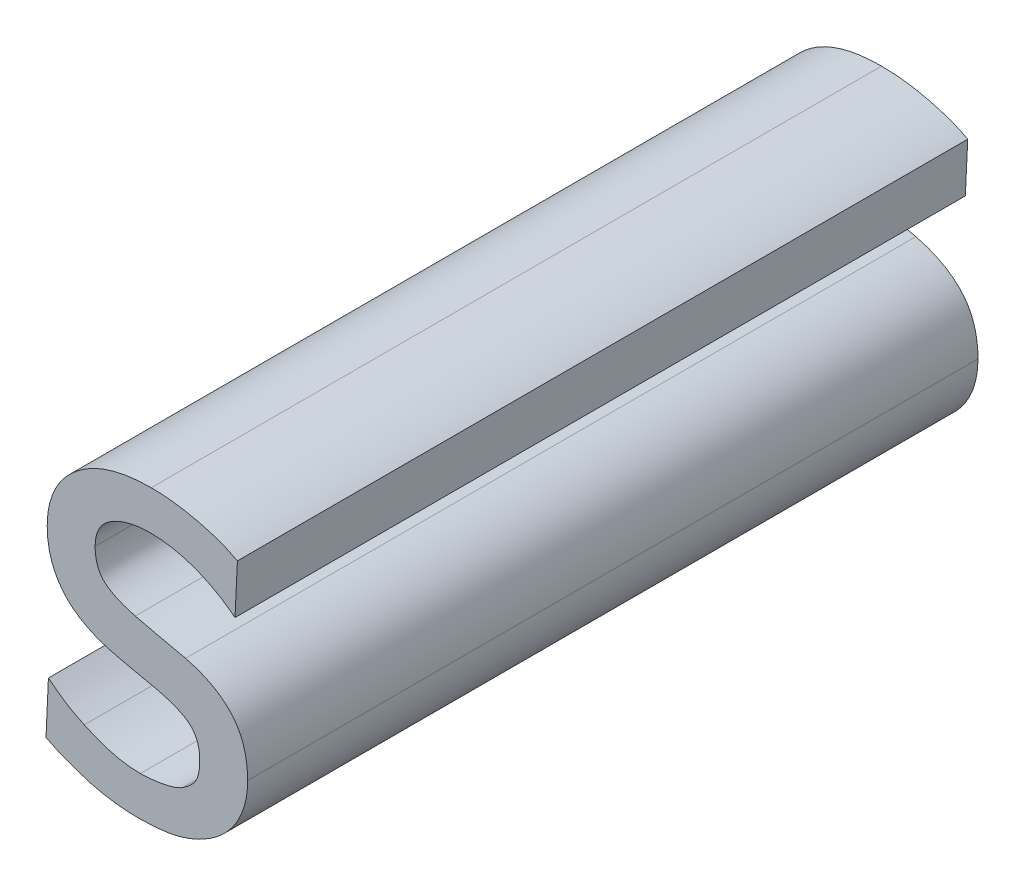
ISO-10303-21;
HEADER;
FILE_DESCRIPTION(('STEP AP214'),'2;1');
FILE_NAME('part.step','',(''),(''),'','','');
FILE_SCHEMA(('AUTOMOTIVE_DESIGN { 1 0 10303 214 1 1 1 1 }'));
ENDSEC;
DATA;
#1=APPLICATION_CONTEXT('core data for automotive mechanical design processes');
#2=APPLICATION_PROTOCOL_DEFINITION('international standard','automotive_design',2000,#1);
#3=PRODUCT_CONTEXT('',#1,'mechanical');
#4=PRODUCT('Part','Part','',(#3));
#5=PRODUCT_RELATED_PRODUCT_CATEGORY('part','',(#4));
#6=PRODUCT_DEFINITION_FORMATION('','',#4);
#7=PRODUCT_DEFINITION_CONTEXT('part definition',#1,'design');
#8=PRODUCT_DEFINITION('design','',#6,#7);
#9=PRODUCT_DEFINITION_SHAPE('','',#8);
#10=(LENGTH_UNIT() NAMED_UNIT(*) SI_UNIT(.MILLI.,.METRE.));
#11=(NAMED_UNIT(*) PLANE_ANGLE_UNIT() SI_UNIT($,.RADIAN.));
#12=(NAMED_UNIT(*) SI_UNIT($,.STERADIAN.) SOLID_ANGLE_UNIT());
#13=UNCERTAINTY_MEASURE_WITH_UNIT(LENGTH_MEASURE(1.E-05),#10,'distance_accuracy_value','');
#14=(GEOMETRIC_REPRESENTATION_CONTEXT(3) GLOBAL_UNCERTAINTY_ASSIGNED_CONTEXT((#13)) GLOBAL_UNIT_ASSIGNED_CONTEXT((#10,
#11,#12)) REPRESENTATION_CONTEXT('',''));
#15=CARTESIAN_POINT('',(0.,0.,0.));
#16=DIRECTION('',(0.,0.,1.));
#17=DIRECTION('',(1.,0.,0.));
#18=AXIS2_PLACEMENT_3D('',#15,#16,#17);
#19=CARTESIAN_POINT('',(-1.643826227401,-1.896351951922,0.));
#20=DIRECTION('',(-1.,0.,0.));
#21=DIRECTION('',(0.,-1.,0.));
#22=AXIS2_PLACEMENT_3D('',#19,#20,#21);
#23=PLANE('',#22);
#24=DIRECTION('',(0.,1.,0.));
#25=VECTOR('',#24,1.);
#26=CARTESIAN_POINT('',(-1.643826227401,-1.903575382263,0.));
#27=LINE('',#26,#25);
#28=CARTESIAN_POINT('',(-1.643826227401,-1.903575382263,0.));
#29=VERTEX_POINT('',#28);
#30=CARTESIAN_POINT('',(-1.643496013443,-1.896351951922,0.));
#31=VERTEX_POINT('',#30);
#32=EDGE_CURVE('E11',#29,#31,#27,.T.);
#33=ORIENTED_EDGE('',*,*,#32,.F.);
#34=DIRECTION('',(0.,0.,1.));
#35=VECTOR('',#34,1.);
#36=CARTESIAN_POINT('',(-1.643826227401,-1.903575382263,0.));
#37=LINE('',#36,#35);
#38=CARTESIAN_POINT('',(-1.643826227401,-1.903575382263,0.1));
#39=VERTEX_POINT('',#38);
#40=EDGE_CURVE('E25',#29,#39,#37,.T.);
#41=ORIENTED_EDGE('',*,*,#40,.T.);
#42=DIRECTION('',(0.,-1.,0.));
#43=VECTOR('',#42,1.);
#44=CARTESIAN_POINT('',(-1.643826227401,-1.903575382263,0.1));
#45=LINE('',#44,#43);
#46=CARTESIAN_POINT('',(-1.643496013443,-1.896351951922,0.1));
#47=VERTEX_POINT('',#46);
#48=EDGE_CURVE('E168',#47,#39,#45,.T.);
#49=ORIENTED_EDGE('',*,*,#48,.F.);
#50=CARTESIAN_POINT('',(-1.643496013443,-1.896351951922,0.));
#51=CARTESIAN_POINT('',(-1.643496013443,-1.896351951922,0.00416666666666667));
#52=CARTESIAN_POINT('',(-1.643496013443,-1.896351951922,0.00833333333333334));
#53=CARTESIAN_POINT('',(-1.643496013443,-1.896351951922,0.0166666666666667));
#54=CARTESIAN_POINT('',(-1.643496013443,-1.896351951922,0.0208333333333333));
#55=CARTESIAN_POINT('',(-1.643496013443,-1.896351951922,0.0291666666666667));
#56=CARTESIAN_POINT('',(-1.643496013443,-1.896351951922,0.0333333333333333));
#57=CARTESIAN_POINT('',(-1.643496013443,-1.896351951922,0.0416666666666667));
#58=CARTESIAN_POINT('',(-1.643496013443,-1.896351951922,0.0458333333333333));
#59=CARTESIAN_POINT('',(-1.643496013443,-1.896351951922,0.0541666666666667));
#60=CARTESIAN_POINT('',(-1.643496013443,-1.896351951922,0.0583333333333333));
#61=CARTESIAN_POINT('',(-1.643496013443,-1.896351951922,0.0666666666666667));
#62=CARTESIAN_POINT('',(-1.643496013443,-1.896351951922,0.0708333333333333));
#63=CARTESIAN_POINT('',(-1.643496013443,-1.896351951922,0.0791666666666667));
#64=CARTESIAN_POINT('',(-1.643496013443,-1.896351951922,0.0833333333333333));
#65=CARTESIAN_POINT('',(-1.643496013443,-1.896351951922,0.0916666666666667));
#66=CARTESIAN_POINT('',(-1.643496013443,-1.896351951922,0.0958333333333333));
#67=CARTESIAN_POINT('',(-1.643496013443,-1.896351951922,0.1));
#68=B_SPLINE_CURVE_WITH_KNOTS('',3,(#50,#51,#52,#53,#54,#55,#56,#57,#58,#59,#60,#61,#62,#63,#64,
#65,#66,#67),.UNSPECIFIED.,.F.,.F.,(4,2,2,2,2,2,2,2,4),(0.,0.0125,0.025,0.0375,0.05,0.0625,
0.075,0.0875,0.1),.UNSPECIFIED.);
#69=EDGE_CURVE('E437',#31,#47,#68,.T.);
#70=ORIENTED_EDGE('',*,*,#69,.F.);
#71=EDGE_LOOP('',(#33,#41,#49,#70));
#72=FACE_BOUND('',#71,.T.);
#73=ADVANCED_FACE('F17',(#72),#23,.T.);
#74=CARTESIAN_POINT('',(-1.63858408081,-1.899447707782,0.));
#75=CARTESIAN_POINT('',(-1.63858408081,-1.899447707782,0.1));
#76=CARTESIAN_POINT('',(-1.640441534327,-1.898580896141,0.));
#77=CARTESIAN_POINT('',(-1.640441534327,-1.898580896141,0.1));
#78=CARTESIAN_POINT('',(-1.642670478547,-1.897012379839,0.));
#79=CARTESIAN_POINT('',(-1.642670478547,-1.897012379839,0.1));
#80=CARTESIAN_POINT('',(-1.643496013443,-1.896351951922,0.));
#81=CARTESIAN_POINT('',(-1.643496013443,-1.896351951922,0.1));
#82=B_SPLINE_SURFACE_WITH_KNOTS('',2,1,((#74,#75),(#76,#77),(#78,#79),(#80,#81)),.UNSPECIFIED.,
.F.,.F.,.F.,(3,1,3),(2,2),(-2.,-1.,0.),(0.,0.01),.UNSPECIFIED.);
#83=CARTESIAN_POINT('',(-1.643496013443,-1.896351951922,0.));
#84=CARTESIAN_POINT('',(-1.642670478547,-1.897012379839,0.));
#85=CARTESIAN_POINT('',(-1.640441534327,-1.898580896141,0.));
#86=CARTESIAN_POINT('',(-1.63858408081,-1.899447707782,0.));
#87=B_SPLINE_CURVE_WITH_KNOTS('',2,(#83,#84,#85,#86),.UNSPECIFIED.,.F.,.F.,(3,1,3),(0.,1.,2.),.UNSPECIFIED.);
#88=CARTESIAN_POINT('',(-1.63858408081,-1.899447707782,0.));
#89=VERTEX_POINT('',#88);
#90=EDGE_CURVE('E635',#31,#89,#87,.T.);
#91=CARTESIAN_POINT('',(-1.63858408081,-1.899447707782,0.1));
#92=CARTESIAN_POINT('',(-1.640441534327,-1.898580896141,0.1));
#93=CARTESIAN_POINT('',(-1.642670478547,-1.897012379839,0.1));
#94=CARTESIAN_POINT('',(-1.643496013443,-1.896351951922,0.1));
#95=B_SPLINE_CURVE_WITH_KNOTS('',2,(#91,#92,#93,#94),.UNSPECIFIED.,.F.,.F.,(3,1,3),(-2.,-1.,0.),.UNSPECIFIED.);
#96=CARTESIAN_POINT('',(-1.63858408081,-1.899447707782,0.1));
#97=VERTEX_POINT('',#96);
#98=EDGE_CURVE('E626',#97,#47,#95,.T.);
#99=DIRECTION('',(0.,0.,1.));
#100=VECTOR('',#99,1.);
#101=CARTESIAN_POINT('',(-1.63858408081,-1.899447707782,0.));
#102=LINE('',#101,#100);
#103=EDGE_CURVE('E620',#89,#97,#102,.T.);
#104=ORIENTED_EDGE('',*,*,#90,.F.);
#105=ORIENTED_EDGE('',*,*,#69,.T.);
#106=ORIENTED_EDGE('',*,*,#98,.F.);
#107=ORIENTED_EDGE('',*,*,#103,.F.);
#108=EDGE_LOOP('',(#104,#105,#106,#107));
#109=FACE_BOUND('',#108,.T.);
#110=ADVANCED_FACE('F406',(#109),#82,.T.);
#111=CARTESIAN_POINT('',(-1.630906606276,-1.901387714789,0.));
#112=CARTESIAN_POINT('',(-1.630906606276,-1.901387714789,0.1));
#113=CARTESIAN_POINT('',(-1.633011720261,-1.901387714789,0.));
#114=CARTESIAN_POINT('',(-1.633011720261,-1.901387714789,0.1));
#115=CARTESIAN_POINT('',(-1.636974287763,-1.900231965934,0.));
#116=CARTESIAN_POINT('',(-1.636974287763,-1.900231965934,0.1));
#117=CARTESIAN_POINT('',(-1.63858408081,-1.899447707782,0.));
#118=CARTESIAN_POINT('',(-1.63858408081,-1.899447707782,0.1));
#119=B_SPLINE_SURFACE_WITH_KNOTS('',2,1,((#111,#112),(#113,#114),(#115,#116),(#117,#118)),
.UNSPECIFIED.,.F.,.F.,.F.,(3,1,3),(2,2),(-2.,-1.,0.),(0.,0.01),.UNSPECIFIED.);
#120=CARTESIAN_POINT('',(-1.63858408081,-1.899447707782,0.));
#121=CARTESIAN_POINT('',(-1.636974287763,-1.900231965934,0.));
#122=CARTESIAN_POINT('',(-1.633011720261,-1.901387714789,0.));
#123=CARTESIAN_POINT('',(-1.630906606276,-1.901387714789,0.));
#124=B_SPLINE_CURVE_WITH_KNOTS('',2,(#120,#121,#122,#123),.UNSPECIFIED.,.F.,.F.,(3,1,3),(0.,1.,
2.),.UNSPECIFIED.);
#125=CARTESIAN_POINT('',(-1.630906606276,-1.901387714789,0.));
#126=VERTEX_POINT('',#125);
#127=EDGE_CURVE('E613',#89,#126,#124,.T.);
#128=CARTESIAN_POINT('',(-1.630906606276,-1.901387714789,0.1));
#129=CARTESIAN_POINT('',(-1.633011720261,-1.901387714789,0.1));
#130=CARTESIAN_POINT('',(-1.636974287763,-1.900231965934,0.1));
#131=CARTESIAN_POINT('',(-1.63858408081,-1.899447707782,0.1));
#132=B_SPLINE_CURVE_WITH_KNOTS('',2,(#128,#129,#130,#131),.UNSPECIFIED.,.F.,.F.,(3,1,3),(-2.,
-1.,0.),.UNSPECIFIED.);
#133=CARTESIAN_POINT('',(-1.630906606276,-1.901387714789,0.1));
#134=VERTEX_POINT('',#133);
#135=EDGE_CURVE('E608',#134,#97,#132,.T.);
#136=DIRECTION('',(0.,0.,1.));
#137=VECTOR('',#136,1.);
#138=CARTESIAN_POINT('',(-1.630906606276,-1.901387714789,0.));
#139=LINE('',#138,#137);
#140=EDGE_CURVE('E602',#126,#134,#139,.T.);
#141=ORIENTED_EDGE('',*,*,#127,.F.);
#142=ORIENTED_EDGE('',*,*,#103,.T.);
#143=ORIENTED_EDGE('',*,*,#135,.F.);
#144=ORIENTED_EDGE('',*,*,#140,.F.);
#145=EDGE_LOOP('',(#141,#142,#143,#144));
#146=FACE_BOUND('',#145,.T.);
#147=ADVANCED_FACE('F396',(#146),#119,.T.);
#148=CARTESIAN_POINT('',(-1.625045308513,-1.900108135699,0.));
#149=CARTESIAN_POINT('',(-1.625045308513,-1.900108135699,0.1));
#150=CARTESIAN_POINT('',(-1.625870843409,-1.900686010127,0.));
#151=CARTESIAN_POINT('',(-1.625870843409,-1.900686010127,0.1));
#152=CARTESIAN_POINT('',(-1.629379366718,-1.901387714789,0.));
#153=CARTESIAN_POINT('',(-1.629379366718,-1.901387714789,0.1));
#154=CARTESIAN_POINT('',(-1.630906606276,-1.901387714789,0.));
#155=CARTESIAN_POINT('',(-1.630906606276,-1.901387714789,0.1));
#156=B_SPLINE_SURFACE_WITH_KNOTS('',2,1,((#148,#149),(#150,#151),(#152,#153),(#154,#155)),
.UNSPECIFIED.,.F.,.F.,.F.,(3,1,3),(2,2),(-2.,-1.,0.),(0.,0.01),.UNSPECIFIED.);
#157=CARTESIAN_POINT('',(-1.630906606276,-1.901387714789,0.));
#158=CARTESIAN_POINT('',(-1.629379366718,-1.901387714789,0.));
#159=CARTESIAN_POINT('',(-1.625870843409,-1.900686010127,0.));
#160=CARTESIAN_POINT('',(-1.625045308513,-1.900108135699,0.));
#161=B_SPLINE_CURVE_WITH_KNOTS('',2,(#157,#158,#159,#160),.UNSPECIFIED.,.F.,.F.,(3,1,3),(0.,1.,
2.),.UNSPECIFIED.);
#162=CARTESIAN_POINT('',(-1.625045308513,-1.900108135699,0.));
#163=VERTEX_POINT('',#162);
#164=EDGE_CURVE('E595',#126,#163,#161,.T.);
#165=CARTESIAN_POINT('',(-1.625045308513,-1.900108135699,0.1));
#166=CARTESIAN_POINT('',(-1.625870843409,-1.900686010127,0.1));
#167=CARTESIAN_POINT('',(-1.629379366718,-1.901387714789,0.1));
#168=CARTESIAN_POINT('',(-1.630906606276,-1.901387714789,0.1));
#169=B_SPLINE_CURVE_WITH_KNOTS('',2,(#165,#166,#167,#168),.UNSPECIFIED.,.F.,.F.,(3,1,3),(-2.,
-1.,0.),.UNSPECIFIED.);
#170=CARTESIAN_POINT('',(-1.625045308513,-1.900108135699,0.1));
#171=VERTEX_POINT('',#170);
#172=EDGE_CURVE('E590',#171,#134,#169,.T.);
#173=DIRECTION('',(0.,0.,1.));
#174=VECTOR('',#173,1.);
#175=CARTESIAN_POINT('',(-1.625045308513,-1.900108135699,0.));
#176=LINE('',#175,#174);
#177=EDGE_CURVE('E584',#163,#171,#176,.T.);
#178=ORIENTED_EDGE('',*,*,#164,.F.);
#179=ORIENTED_EDGE('',*,*,#140,.T.);
#180=ORIENTED_EDGE('',*,*,#172,.F.);
#181=ORIENTED_EDGE('',*,*,#177,.F.);
#182=EDGE_LOOP('',(#178,#179,#180,#181));
#183=FACE_BOUND('',#182,.T.);
#184=ADVANCED_FACE('F385',(#183),#156,.T.);
#185=CARTESIAN_POINT('',(-1.622775087548,-1.89573280075,0.));
#186=CARTESIAN_POINT('',(-1.622775087548,-1.89573280075,0.1));
#187=CARTESIAN_POINT('',(-1.622775087548,-1.897548977521,0.));
#188=CARTESIAN_POINT('',(-1.622775087548,-1.897548977521,0.1));
#189=CARTESIAN_POINT('',(-1.623848282913,-1.899323877548,0.));
#190=CARTESIAN_POINT('',(-1.623848282913,-1.899323877548,0.1));
#191=CARTESIAN_POINT('',(-1.625045308513,-1.900108135699,0.));
#192=CARTESIAN_POINT('',(-1.625045308513,-1.900108135699,0.1));
#193=B_SPLINE_SURFACE_WITH_KNOTS('',2,1,((#185,#186),(#187,#188),(#189,#190),(#191,#192)),
.UNSPECIFIED.,.F.,.F.,.F.,(3,1,3),(2,2),(-2.,-1.,0.),(0.,0.01),.UNSPECIFIED.);
#194=CARTESIAN_POINT('',(-1.625045308513,-1.900108135699,0.));
#195=CARTESIAN_POINT('',(-1.623848282913,-1.899323877548,0.));
#196=CARTESIAN_POINT('',(-1.622775087548,-1.897548977521,0.));
#197=CARTESIAN_POINT('',(-1.622775087548,-1.89573280075,0.));
#198=B_SPLINE_CURVE_WITH_KNOTS('',2,(#194,#195,#196,#197),.UNSPECIFIED.,.F.,.F.,(3,1,3),(0.,1.,
2.),.UNSPECIFIED.);
#199=CARTESIAN_POINT('',(-1.622775087548,-1.89573280075,0.));
#200=VERTEX_POINT('',#199);
#201=EDGE_CURVE('E577',#163,#200,#198,.T.);
#202=CARTESIAN_POINT('',(-1.622775087548,-1.89573280075,0.1));
#203=CARTESIAN_POINT('',(-1.622775087548,-1.897548977521,0.1));
#204=CARTESIAN_POINT('',(-1.623848282913,-1.899323877548,0.1));
#205=CARTESIAN_POINT('',(-1.625045308513,-1.900108135699,0.1));
#206=B_SPLINE_CURVE_WITH_KNOTS('',2,(#202,#203,#204,#205),.UNSPECIFIED.,.F.,.F.,(3,1,3),(-2.,
-1.,0.),.UNSPECIFIED.);
#207=CARTESIAN_POINT('',(-1.622775087548,-1.89573280075,0.1));
#208=VERTEX_POINT('',#207);
#209=EDGE_CURVE('E572',#208,#171,#206,.T.);
#210=DIRECTION('',(0.,0.,1.));
#211=VECTOR('',#210,1.);
#212=CARTESIAN_POINT('',(-1.622775087548,-1.89573280075,0.));
#213=LINE('',#212,#211);
#214=EDGE_CURVE('E566',#200,#208,#213,.T.);
#215=ORIENTED_EDGE('',*,*,#201,.F.);
#216=ORIENTED_EDGE('',*,*,#177,.T.);
#217=ORIENTED_EDGE('',*,*,#209,.F.);
#218=ORIENTED_EDGE('',*,*,#214,.F.);
#219=EDGE_LOOP('',(#215,#216,#217,#218));
#220=FACE_BOUND('',#219,.T.);
#221=ADVANCED_FACE('F374',(#220),#193,.T.);
#222=CARTESIAN_POINT('',(-1.628430001587,-1.89032554718,0.));
#223=CARTESIAN_POINT('',(-1.628430001587,-1.89032554718,0.1));
#224=CARTESIAN_POINT('',(-1.625251692237,-1.891109805331,0.));
#225=CARTESIAN_POINT('',(-1.625251692237,-1.891109805331,0.1));
#226=CARTESIAN_POINT('',(-1.622775087548,-1.893462579785,0.));
#227=CARTESIAN_POINT('',(-1.622775087548,-1.893462579785,0.1));
#228=CARTESIAN_POINT('',(-1.622775087548,-1.89573280075,0.));
#229=CARTESIAN_POINT('',(-1.622775087548,-1.89573280075,0.1));
#230=B_SPLINE_SURFACE_WITH_KNOTS('',2,1,((#222,#223),(#224,#225),(#226,#227),(#228,#229)),
.UNSPECIFIED.,.F.,.F.,.F.,(3,1,3),(2,2),(-2.,-1.,0.),(0.,0.01),.UNSPECIFIED.);
#231=CARTESIAN_POINT('',(-1.622775087548,-1.89573280075,0.));
#232=CARTESIAN_POINT('',(-1.622775087548,-1.893462579785,0.));
#233=CARTESIAN_POINT('',(-1.625251692237,-1.891109805331,0.));
#234=CARTESIAN_POINT('',(-1.628430001587,-1.89032554718,0.));
#235=B_SPLINE_CURVE_WITH_KNOTS('',2,(#231,#232,#233,#234),.UNSPECIFIED.,.F.,.F.,(3,1,3),(0.,1.,
2.),.UNSPECIFIED.);
#236=CARTESIAN_POINT('',(-1.628430001587,-1.89032554718,0.));
#237=VERTEX_POINT('',#236);
#238=EDGE_CURVE('E559',#200,#237,#235,.T.);
#239=CARTESIAN_POINT('',(-1.628430001587,-1.89032554718,0.1));
#240=CARTESIAN_POINT('',(-1.625251692237,-1.891109805331,0.1));
#241=CARTESIAN_POINT('',(-1.622775087548,-1.893462579785,0.1));
#242=CARTESIAN_POINT('',(-1.622775087548,-1.89573280075,0.1));
#243=B_SPLINE_CURVE_WITH_KNOTS('',2,(#239,#240,#241,#242),.UNSPECIFIED.,.F.,.F.,(3,1,3),(-2.,
-1.,0.),.UNSPECIFIED.);
#244=CARTESIAN_POINT('',(-1.628430001587,-1.89032554718,0.1));
#245=VERTEX_POINT('',#244);
#246=EDGE_CURVE('E554',#245,#208,#243,.T.);
#247=DIRECTION('',(0.,0.,1.));
#248=VECTOR('',#247,1.);
#249=CARTESIAN_POINT('',(-1.628430001587,-1.89032554718,0.));
#250=LINE('',#249,#248);
#251=EDGE_CURVE('E548',#237,#245,#250,.T.);
#252=ORIENTED_EDGE('',*,*,#238,.F.);
#253=ORIENTED_EDGE('',*,*,#214,.T.);
#254=ORIENTED_EDGE('',*,*,#246,.F.);
#255=ORIENTED_EDGE('',*,*,#251,.F.);
#256=EDGE_LOOP('',(#252,#253,#254,#255));
#257=FACE_BOUND('',#256,.T.);
#258=ADVANCED_FACE('F363',(#257),#230,.T.);
#259=CARTESIAN_POINT('',(-1.635323217971,-1.888757030877,0.));
#260=CARTESIAN_POINT('',(-1.635323217971,-1.888757030877,0.1));
#261=CARTESIAN_POINT('',(-1.633630871433,-1.88921107507,0.));
#262=CARTESIAN_POINT('',(-1.633630871433,-1.88921107507,0.1));
#263=CARTESIAN_POINT('',(-1.629668303932,-1.890036609966,0.));
#264=CARTESIAN_POINT('',(-1.629668303932,-1.890036609966,0.1));
#265=CARTESIAN_POINT('',(-1.628430001587,-1.89032554718,0.));
#266=CARTESIAN_POINT('',(-1.628430001587,-1.89032554718,0.1));
#267=B_SPLINE_SURFACE_WITH_KNOTS('',2,1,((#259,#260),(#261,#262),(#263,#264),(#265,#266)),
.UNSPECIFIED.,.F.,.F.,.F.,(3,1,3),(2,2),(-2.,-1.,0.),(0.,0.01),.UNSPECIFIED.);
#268=CARTESIAN_POINT('',(-1.628430001587,-1.89032554718,0.));
#269=CARTESIAN_POINT('',(-1.629668303932,-1.890036609966,0.));
#270=CARTESIAN_POINT('',(-1.633630871433,-1.88921107507,0.));
#271=CARTESIAN_POINT('',(-1.635323217971,-1.888757030877,0.));
#272=B_SPLINE_CURVE_WITH_KNOTS('',2,(#268,#269,#270,#271),.UNSPECIFIED.,.F.,.F.,(3,1,3),(0.,1.,
2.),.UNSPECIFIED.);
#273=CARTESIAN_POINT('',(-1.635323217971,-1.888757030877,0.));
#274=VERTEX_POINT('',#273);
#275=EDGE_CURVE('E541',#237,#274,#272,.T.);
#276=CARTESIAN_POINT('',(-1.635323217971,-1.888757030877,0.1));
#277=CARTESIAN_POINT('',(-1.633630871433,-1.88921107507,0.1));
#278=CARTESIAN_POINT('',(-1.629668303932,-1.890036609966,0.1));
#279=CARTESIAN_POINT('',(-1.628430001587,-1.89032554718,0.1));
#280=B_SPLINE_CURVE_WITH_KNOTS('',2,(#276,#277,#278,#279),.UNSPECIFIED.,.F.,.F.,(3,1,3),(-2.,
-1.,0.),.UNSPECIFIED.);
#281=CARTESIAN_POINT('',(-1.635323217971,-1.888757030877,0.1));
#282=VERTEX_POINT('',#281);
#283=EDGE_CURVE('E536',#282,#245,#280,.T.);
#284=DIRECTION('',(0.,0.,1.));
#285=VECTOR('',#284,1.);
#286=CARTESIAN_POINT('',(-1.635323217971,-1.888757030877,0.));
#287=LINE('',#286,#285);
#288=EDGE_CURVE('E530',#274,#282,#287,.T.);
#289=ORIENTED_EDGE('',*,*,#275,.F.);
#290=ORIENTED_EDGE('',*,*,#251,.T.);
#291=ORIENTED_EDGE('',*,*,#283,.F.);
#292=ORIENTED_EDGE('',*,*,#288,.F.);
#293=EDGE_LOOP('',(#289,#290,#291,#292));
#294=FACE_BOUND('',#293,.T.);
#295=ADVANCED_FACE('F352',(#294),#267,.T.);
#296=CARTESIAN_POINT('',(-1.643661120422,-1.878437844674,0.));
#297=CARTESIAN_POINT('',(-1.643661120422,-1.878437844674,0.1));
#298=CARTESIAN_POINT('',(-1.643661120422,-1.882194028452,0.));
#299=CARTESIAN_POINT('',(-1.643661120422,-1.882194028452,0.1));
#300=CARTESIAN_POINT('',(-1.63969855292,-1.887477451788,0.));
#301=CARTESIAN_POINT('',(-1.63969855292,-1.887477451788,0.1));
#302=CARTESIAN_POINT('',(-1.635323217971,-1.888757030877,0.));
#303=CARTESIAN_POINT('',(-1.635323217971,-1.888757030877,0.1));
#304=B_SPLINE_SURFACE_WITH_KNOTS('',2,1,((#296,#297),(#298,#299),(#300,#301),(#302,#303)),
.UNSPECIFIED.,.F.,.F.,.F.,(3,1,3),(2,2),(-2.,-1.,0.),(0.,0.01),.UNSPECIFIED.);
#305=CARTESIAN_POINT('',(-1.635323217971,-1.888757030877,0.));
#306=CARTESIAN_POINT('',(-1.63969855292,-1.887477451788,0.));
#307=CARTESIAN_POINT('',(-1.643661120422,-1.882194028452,0.));
#308=CARTESIAN_POINT('',(-1.643661120422,-1.878437844674,0.));
#309=B_SPLINE_CURVE_WITH_KNOTS('',2,(#305,#306,#307,#308),.UNSPECIFIED.,.F.,.F.,(3,1,3),(0.,1.,
2.),.UNSPECIFIED.);
#310=CARTESIAN_POINT('',(-1.643661120422,-1.878437844674,0.));
#311=VERTEX_POINT('',#310);
#312=EDGE_CURVE('E523',#274,#311,#309,.T.);
#313=CARTESIAN_POINT('',(-1.643661120422,-1.878437844674,0.1));
#314=CARTESIAN_POINT('',(-1.643661120422,-1.882194028452,0.1));
#315=CARTESIAN_POINT('',(-1.63969855292,-1.887477451788,0.1));
#316=CARTESIAN_POINT('',(-1.635323217971,-1.888757030877,0.1));
#317=B_SPLINE_CURVE_WITH_KNOTS('',2,(#313,#314,#315,#316),.UNSPECIFIED.,.F.,.F.,(3,1,3),(-2.,
-1.,0.),.UNSPECIFIED.);
#318=CARTESIAN_POINT('',(-1.643661120422,-1.878437844674,0.1));
#319=VERTEX_POINT('',#318);
#320=EDGE_CURVE('E518',#319,#282,#317,.T.);
#321=DIRECTION('',(0.,0.,1.));
#322=VECTOR('',#321,1.);
#323=CARTESIAN_POINT('',(-1.643661120422,-1.878437844674,0.));
#324=LINE('',#323,#322);
#325=EDGE_CURVE('E512',#311,#319,#324,.T.);
#326=ORIENTED_EDGE('',*,*,#312,.F.);
#327=ORIENTED_EDGE('',*,*,#288,.T.);
#328=ORIENTED_EDGE('',*,*,#320,.F.);
#329=ORIENTED_EDGE('',*,*,#325,.F.);
#330=EDGE_LOOP('',(#326,#327,#328,#329));
#331=FACE_BOUND('',#330,.T.);
#332=ADVANCED_FACE('F341',(#331),#304,.T.);
#333=CARTESIAN_POINT('',(-1.629420643463,-1.866756525893,0.));
#334=CARTESIAN_POINT('',(-1.629420643463,-1.866756525893,0.1));
#335=CARTESIAN_POINT('',(-1.635859815653,-1.866756525893,0.));
#336=CARTESIAN_POINT('',(-1.635859815653,-1.866756525893,0.1));
#337=CARTESIAN_POINT('',(-1.643661120422,-1.873236974828,0.));
#338=CARTESIAN_POINT('',(-1.643661120422,-1.873236974828,0.1));
#339=CARTESIAN_POINT('',(-1.643661120422,-1.878437844674,0.));
#340=CARTESIAN_POINT('',(-1.643661120422,-1.878437844674,0.1));
#341=B_SPLINE_SURFACE_WITH_KNOTS('',2,1,((#333,#334),(#335,#336),(#337,#338),(#339,#340)),
.UNSPECIFIED.,.F.,.F.,.F.,(3,1,3),(2,2),(-2.,-1.,0.),(0.,0.01),.UNSPECIFIED.);
#342=CARTESIAN_POINT('',(-1.643661120422,-1.878437844674,0.));
#343=CARTESIAN_POINT('',(-1.643661120422,-1.873236974828,0.));
#344=CARTESIAN_POINT('',(-1.635859815653,-1.866756525893,0.));
#345=CARTESIAN_POINT('',(-1.629420643463,-1.866756525893,0.));
#346=B_SPLINE_CURVE_WITH_KNOTS('',2,(#342,#343,#344,#345),.UNSPECIFIED.,.F.,.F.,(3,1,3),(0.,1.,
2.),.UNSPECIFIED.);
#347=CARTESIAN_POINT('',(-1.629420643463,-1.866756525893,0.));
#348=VERTEX_POINT('',#347);
#349=EDGE_CURVE('E505',#311,#348,#346,.T.);
#350=CARTESIAN_POINT('',(-1.629420643463,-1.866756525893,0.1));
#351=CARTESIAN_POINT('',(-1.635859815653,-1.866756525893,0.1));
#352=CARTESIAN_POINT('',(-1.643661120422,-1.873236974828,0.1));
#353=CARTESIAN_POINT('',(-1.643661120422,-1.878437844674,0.1));
#354=B_SPLINE_CURVE_WITH_KNOTS('',2,(#350,#351,#352,#353),.UNSPECIFIED.,.F.,.F.,(3,1,3),(-2.,
-1.,0.),.UNSPECIFIED.);
#355=CARTESIAN_POINT('',(-1.629420643463,-1.866756525893,0.1));
#356=VERTEX_POINT('',#355);
#357=EDGE_CURVE('E500',#356,#319,#354,.T.);
#358=DIRECTION('',(0.,0.,1.));
#359=VECTOR('',#358,1.);
#360=CARTESIAN_POINT('',(-1.629420643463,-1.866756525893,0.));
#361=LINE('',#360,#359);
#362=EDGE_CURVE('E494',#348,#356,#361,.T.);
#363=ORIENTED_EDGE('',*,*,#349,.F.);
#364=ORIENTED_EDGE('',*,*,#325,.T.);
#365=ORIENTED_EDGE('',*,*,#357,.F.);
#366=ORIENTED_EDGE('',*,*,#362,.F.);
#367=EDGE_LOOP('',(#363,#364,#365,#366));
#368=FACE_BOUND('',#367,.T.);
#369=ADVANCED_FACE('F330',(#368),#341,.T.);
#370=CARTESIAN_POINT('',(-1.617615494447,-1.869522067795,0.));
#371=CARTESIAN_POINT('',(-1.617615494447,-1.869522067795,0.1));
#372=CARTESIAN_POINT('',(-1.619803161922,-1.868325042196,0.));
#373=CARTESIAN_POINT('',(-1.619803161922,-1.868325042196,0.1));
#374=CARTESIAN_POINT('',(-1.626242334112,-1.866756525893,0.));
#375=CARTESIAN_POINT('',(-1.626242334112,-1.866756525893,0.1));
#376=CARTESIAN_POINT('',(-1.629420643463,-1.866756525893,0.));
#377=CARTESIAN_POINT('',(-1.629420643463,-1.866756525893,0.1));
#378=B_SPLINE_SURFACE_WITH_KNOTS('',2,1,((#370,#371),(#372,#373),(#374,#375),(#376,#377)),
.UNSPECIFIED.,.F.,.F.,.F.,(3,1,3),(2,2),(-2.,-1.,0.),(0.,0.01),.UNSPECIFIED.);
#379=CARTESIAN_POINT('',(-1.629420643463,-1.866756525893,0.));
#380=CARTESIAN_POINT('',(-1.626242334112,-1.866756525893,0.));
#381=CARTESIAN_POINT('',(-1.619803161922,-1.868325042196,0.));
#382=CARTESIAN_POINT('',(-1.617615494447,-1.869522067795,0.));
#383=B_SPLINE_CURVE_WITH_KNOTS('',2,(#379,#380,#381,#382),.UNSPECIFIED.,.F.,.F.,(3,1,3),(0.,1.,
2.),.UNSPECIFIED.);
#384=CARTESIAN_POINT('',(-1.617615494447,-1.869522067795,0.));
#385=VERTEX_POINT('',#384);
#386=EDGE_CURVE('E487',#348,#385,#383,.T.);
#387=CARTESIAN_POINT('',(-1.617615494447,-1.869522067795,0.1));
#388=CARTESIAN_POINT('',(-1.619803161922,-1.868325042196,0.1));
#389=CARTESIAN_POINT('',(-1.626242334112,-1.866756525893,0.1));
#390=CARTESIAN_POINT('',(-1.629420643463,-1.866756525893,0.1));
#391=B_SPLINE_CURVE_WITH_KNOTS('',2,(#387,#388,#389,#390),.UNSPECIFIED.,.F.,.F.,(3,1,3),(-2.,
-1.,0.),.UNSPECIFIED.);
#392=CARTESIAN_POINT('',(-1.617615494447,-1.869522067795,0.1));
#393=VERTEX_POINT('',#392);
#394=EDGE_CURVE('E482',#393,#356,#391,.T.);
#395=DIRECTION('',(0.,0.,1.));
#396=VECTOR('',#395,1.);
#397=CARTESIAN_POINT('',(-1.617615494447,-1.869522067795,0.));
#398=LINE('',#397,#396);
#399=EDGE_CURVE('E479',#385,#393,#398,.T.);
#400=ORIENTED_EDGE('',*,*,#386,.F.);
#401=ORIENTED_EDGE('',*,*,#362,.T.);
#402=ORIENTED_EDGE('',*,*,#394,.F.);
#403=ORIENTED_EDGE('',*,*,#399,.F.);
#404=EDGE_LOOP('',(#400,#401,#402,#403));
#405=FACE_BOUND('',#404,.T.);
#406=ADVANCED_FACE('F320',(#405),#378,.T.);
#407=CARTESIAN_POINT('',(-1.617615494447,-1.876415284179,0.));
#408=DIRECTION('',(1.,0.,0.));
#409=DIRECTION('',(0.,1.,0.));
#410=AXIS2_PLACEMENT_3D('',#407,#408,#409);
#411=PLANE('',#410);
#412=DIRECTION('',(0.,-1.,0.));
#413=VECTOR('',#412,1.);
#414=CARTESIAN_POINT('',(-1.617615494447,-1.869522067795,0.));
#415=LINE('',#414,#413);
#416=CARTESIAN_POINT('',(-1.617945708406,-1.876415284179,0.));
#417=VERTEX_POINT('',#416);
#418=EDGE_CURVE('E475',#385,#417,#415,.T.);
#419=ORIENTED_EDGE('',*,*,#418,.F.);
#420=ORIENTED_EDGE('',*,*,#399,.T.);
#421=DIRECTION('',(0.,1.,0.));
#422=VECTOR('',#421,1.);
#423=CARTESIAN_POINT('',(-1.617615494447,-1.869522067795,0.1));
#424=LINE('',#423,#422);
#425=CARTESIAN_POINT('',(-1.617945708406,-1.876415284179,0.1));
#426=VERTEX_POINT('',#425);
#427=EDGE_CURVE('E468',#426,#393,#424,.T.);
#428=ORIENTED_EDGE('',*,*,#427,.F.);
#429=CARTESIAN_POINT('',(-1.617945708406,-1.876415284179,0.));
#430=CARTESIAN_POINT('',(-1.617945708406,-1.876415284179,0.00416666666666668));
#431=CARTESIAN_POINT('',(-1.617945708406,-1.876415284179,0.00833333333333334));
#432=CARTESIAN_POINT('',(-1.617945708406,-1.876415284179,0.0166666666666667));
#433=CARTESIAN_POINT('',(-1.617945708406,-1.876415284179,0.0208333333333333));
#434=CARTESIAN_POINT('',(-1.617945708406,-1.876415284179,0.0291666666666667));
#435=CARTESIAN_POINT('',(-1.617945708406,-1.876415284179,0.0333333333333333));
#436=CARTESIAN_POINT('',(-1.617945708406,-1.876415284179,0.0416666666666667));
#437=CARTESIAN_POINT('',(-1.617945708406,-1.876415284179,0.0458333333333333));
#438=CARTESIAN_POINT('',(-1.617945708406,-1.876415284179,0.0541666666666667));
#439=CARTESIAN_POINT('',(-1.617945708406,-1.876415284179,0.0583333333333333));
#440=CARTESIAN_POINT('',(-1.617945708406,-1.876415284179,0.0666666666666667));
#441=CARTESIAN_POINT('',(-1.617945708406,-1.876415284179,0.0708333333333333));
#442=CARTESIAN_POINT('',(-1.617945708406,-1.876415284179,0.0791666666666667));
#443=CARTESIAN_POINT('',(-1.617945708406,-1.876415284179,0.0833333333333333));
#444=CARTESIAN_POINT('',(-1.617945708406,-1.876415284179,0.0916666666666667));
#445=CARTESIAN_POINT('',(-1.617945708406,-1.876415284179,0.0958333333333333));
#446=CARTESIAN_POINT('',(-1.617945708406,-1.876415284179,0.1));
#447=B_SPLINE_CURVE_WITH_KNOTS('',3,(#429,#430,#431,#432,#433,#434,#435,#436,#437,#438,#439,
#440,#441,#442,#443,#444,#445,#446),.UNSPECIFIED.,.F.,.F.,(4,2,2,2,2,2,2,2,4),(0.,0.0125,0.025,
0.0375,0.05,0.0625,0.075,0.0875,0.1),.UNSPECIFIED.);
#448=EDGE_CURVE('E302',#417,#426,#447,.T.);
#449=ORIENTED_EDGE('',*,*,#448,.F.);
#450=EDGE_LOOP('',(#419,#420,#428,#449));
#451=FACE_BOUND('',#450,.T.);
#452=ADVANCED_FACE('F309',(#451),#411,.T.);
#453=CARTESIAN_POINT('',(-1.629544473697,-1.872163779463,0.));
#454=CARTESIAN_POINT('',(-1.629544473697,-1.872163779463,0.1));
#455=CARTESIAN_POINT('',(-1.626448717836,-1.872163779463,0.));
#456=CARTESIAN_POINT('',(-1.626448717836,-1.872163779463,0.1));
#457=CARTESIAN_POINT('',(-1.620422313094,-1.874434000428,0.));
#458=CARTESIAN_POINT('',(-1.620422313094,-1.874434000428,0.1));
#459=CARTESIAN_POINT('',(-1.617945708406,-1.876415284179,0.));
#460=CARTESIAN_POINT('',(-1.617945708406,-1.876415284179,0.1));
#461=B_SPLINE_SURFACE_WITH_KNOTS('',2,1,((#453,#454),(#455,#456),(#457,#458),(#459,#460)),
.UNSPECIFIED.,.F.,.F.,.F.,(3,1,3),(2,2),(-2.,-1.,0.),(0.,0.01),.UNSPECIFIED.);
#462=CARTESIAN_POINT('',(-1.617945708406,-1.876415284179,0.));
#463=CARTESIAN_POINT('',(-1.620422313094,-1.874434000428,0.));
#464=CARTESIAN_POINT('',(-1.626448717836,-1.872163779463,0.));
#465=CARTESIAN_POINT('',(-1.629544473697,-1.872163779463,0.));
#466=B_SPLINE_CURVE_WITH_KNOTS('',2,(#462,#463,#464,#465),.UNSPECIFIED.,.F.,.F.,(3,1,3),(0.,1.,
2.),.UNSPECIFIED.);
#467=CARTESIAN_POINT('',(-1.629544473697,-1.872163779463,0.));
#468=VERTEX_POINT('',#467);
#469=EDGE_CURVE('E293',#417,#468,#466,.T.);
#470=CARTESIAN_POINT('',(-1.629544473697,-1.872163779463,0.1));
#471=CARTESIAN_POINT('',(-1.626448717836,-1.872163779463,0.1));
#472=CARTESIAN_POINT('',(-1.620422313094,-1.874434000428,0.1));
#473=CARTESIAN_POINT('',(-1.617945708406,-1.876415284179,0.1));
#474=B_SPLINE_CURVE_WITH_KNOTS('',2,(#470,#471,#472,#473),.UNSPECIFIED.,.F.,.F.,(3,1,3),(-2.,
-1.,0.),.UNSPECIFIED.);
#475=CARTESIAN_POINT('',(-1.629544473697,-1.872163779463,0.1));
#476=VERTEX_POINT('',#475);
#477=EDGE_CURVE('E283',#476,#426,#474,.T.);
#478=DIRECTION('',(0.,0.,1.));
#479=VECTOR('',#478,1.);
#480=CARTESIAN_POINT('',(-1.629544473697,-1.872163779463,0.));
#481=LINE('',#480,#479);
#482=EDGE_CURVE('E277',#468,#476,#481,.T.);
#483=ORIENTED_EDGE('',*,*,#469,.F.);
#484=ORIENTED_EDGE('',*,*,#448,.T.);
#485=ORIENTED_EDGE('',*,*,#477,.F.);
#486=ORIENTED_EDGE('',*,*,#482,.F.);
#487=EDGE_LOOP('',(#483,#484,#485,#486));
#488=FACE_BOUND('',#487,.T.);
#489=ADVANCED_FACE('F319',(#488),#461,.T.);
#490=CARTESIAN_POINT('',(-1.637098117997,-1.877529756288,0.));
#491=CARTESIAN_POINT('',(-1.637098117997,-1.877529756288,0.1));
#492=CARTESIAN_POINT('',(-1.637098117997,-1.874846767876,0.));
#493=CARTESIAN_POINT('',(-1.637098117997,-1.874846767876,0.1));
#494=CARTESIAN_POINT('',(-1.632722783047,-1.872163779463,0.));
#495=CARTESIAN_POINT('',(-1.632722783047,-1.872163779463,0.1));
#496=CARTESIAN_POINT('',(-1.629544473697,-1.872163779463,0.));
#497=CARTESIAN_POINT('',(-1.629544473697,-1.872163779463,0.1));
#498=B_SPLINE_SURFACE_WITH_KNOTS('',2,1,((#490,#491),(#492,#493),(#494,#495),(#496,#497)),
.UNSPECIFIED.,.F.,.F.,.F.,(3,1,3),(2,2),(-2.,-1.,0.),(0.,0.01),.UNSPECIFIED.);
#499=CARTESIAN_POINT('',(-1.629544473697,-1.872163779463,0.));
#500=CARTESIAN_POINT('',(-1.632722783047,-1.872163779463,0.));
#501=CARTESIAN_POINT('',(-1.637098117997,-1.874846767876,0.));
#502=CARTESIAN_POINT('',(-1.637098117997,-1.877529756288,0.));
#503=B_SPLINE_CURVE_WITH_KNOTS('',2,(#499,#500,#501,#502),.UNSPECIFIED.,.F.,.F.,(3,1,3),(0.,1.,
2.),.UNSPECIFIED.);
#504=CARTESIAN_POINT('',(-1.637098117997,-1.877529756288,0.));
#505=VERTEX_POINT('',#504);
#506=EDGE_CURVE('E270',#468,#505,#503,.T.);
#507=CARTESIAN_POINT('',(-1.637098117997,-1.877529756288,0.1));
#508=CARTESIAN_POINT('',(-1.637098117997,-1.874846767876,0.1));
#509=CARTESIAN_POINT('',(-1.632722783047,-1.872163779463,0.1));
#510=CARTESIAN_POINT('',(-1.629544473697,-1.872163779463,0.1));
#511=B_SPLINE_CURVE_WITH_KNOTS('',2,(#507,#508,#509,#510),.UNSPECIFIED.,.F.,.F.,(3,1,3),(-2.,
-1.,0.),.UNSPECIFIED.);
#512=CARTESIAN_POINT('',(-1.637098117997,-1.877529756288,0.1));
#513=VERTEX_POINT('',#512);
#514=EDGE_CURVE('E265',#513,#476,#511,.T.);
#515=DIRECTION('',(0.,0.,1.));
#516=VECTOR('',#515,1.);
#517=CARTESIAN_POINT('',(-1.637098117997,-1.877529756288,0.));
#518=LINE('',#517,#516);
#519=EDGE_CURVE('E259',#505,#513,#518,.T.);
#520=ORIENTED_EDGE('',*,*,#506,.F.);
#521=ORIENTED_EDGE('',*,*,#482,.T.);
#522=ORIENTED_EDGE('',*,*,#514,.F.);
#523=ORIENTED_EDGE('',*,*,#519,.F.);
#524=EDGE_LOOP('',(#520,#521,#522,#523));
#525=FACE_BOUND('',#524,.T.);
#526=ADVANCED_FACE('F461',(#525),#498,.T.);
#527=CARTESIAN_POINT('',(-1.631608310938,-1.883060840093,0.));
#528=CARTESIAN_POINT('',(-1.631608310938,-1.883060840093,0.1));
#529=CARTESIAN_POINT('',(-1.634497683074,-1.882317858686,0.));
#530=CARTESIAN_POINT('',(-1.634497683074,-1.882317858686,0.1));
#531=CARTESIAN_POINT('',(-1.637098117997,-1.879965084232,0.));
#532=CARTESIAN_POINT('',(-1.637098117997,-1.879965084232,0.1));
#533=CARTESIAN_POINT('',(-1.637098117997,-1.877529756288,0.));
#534=CARTESIAN_POINT('',(-1.637098117997,-1.877529756288,0.1));
#535=B_SPLINE_SURFACE_WITH_KNOTS('',2,1,((#527,#528),(#529,#530),(#531,#532),(#533,#534)),
.UNSPECIFIED.,.F.,.F.,.F.,(3,1,3),(2,2),(-2.,-1.,0.),(0.,0.01),.UNSPECIFIED.);
#536=CARTESIAN_POINT('',(-1.637098117997,-1.877529756288,0.));
#537=CARTESIAN_POINT('',(-1.637098117997,-1.879965084232,0.));
#538=CARTESIAN_POINT('',(-1.634497683074,-1.882317858686,0.));
#539=CARTESIAN_POINT('',(-1.631608310938,-1.883060840093,0.));
#540=B_SPLINE_CURVE_WITH_KNOTS('',2,(#536,#537,#538,#539),.UNSPECIFIED.,.F.,.F.,(3,1,3),(0.,1.,
2.),.UNSPECIFIED.);
#541=CARTESIAN_POINT('',(-1.631608310938,-1.883060840093,0.));
#542=VERTEX_POINT('',#541);
#543=EDGE_CURVE('E252',#505,#542,#540,.T.);
#544=CARTESIAN_POINT('',(-1.631608310938,-1.883060840093,0.1));
#545=CARTESIAN_POINT('',(-1.634497683074,-1.882317858686,0.1));
#546=CARTESIAN_POINT('',(-1.637098117997,-1.879965084232,0.1));
#547=CARTESIAN_POINT('',(-1.637098117997,-1.877529756288,0.1));
#548=B_SPLINE_CURVE_WITH_KNOTS('',2,(#544,#545,#546,#547),.UNSPECIFIED.,.F.,.F.,(3,1,3),(-2.,
-1.,0.),.UNSPECIFIED.);
#549=CARTESIAN_POINT('',(-1.631608310938,-1.883060840093,0.1));
#550=VERTEX_POINT('',#549);
#551=EDGE_CURVE('E247',#550,#513,#548,.T.);
#552=DIRECTION('',(0.,0.,1.));
#553=VECTOR('',#552,1.);
#554=CARTESIAN_POINT('',(-1.631608310938,-1.883060840093,0.));
#555=LINE('',#554,#553);
#556=EDGE_CURVE('E241',#542,#550,#555,.T.);
#557=ORIENTED_EDGE('',*,*,#543,.F.);
#558=ORIENTED_EDGE('',*,*,#519,.T.);
#559=ORIENTED_EDGE('',*,*,#551,.F.);
#560=ORIENTED_EDGE('',*,*,#556,.F.);
#561=EDGE_LOOP('',(#557,#558,#559,#560));
#562=FACE_BOUND('',#561,.T.);
#563=ADVANCED_FACE('F457',(#562),#535,.T.);
#564=CARTESIAN_POINT('',(-1.624715094554,-1.884629356396,0.));
#565=CARTESIAN_POINT('',(-1.624715094554,-1.884629356396,0.1));
#566=CARTESIAN_POINT('',(-1.62665510156,-1.884175312203,0.));
#567=CARTESIAN_POINT('',(-1.62665510156,-1.884175312203,0.1));
#568=CARTESIAN_POINT('',(-1.630204901614,-1.883432330796,0.));
#569=CARTESIAN_POINT('',(-1.630204901614,-1.883432330796,0.1));
#570=CARTESIAN_POINT('',(-1.631608310938,-1.883060840093,0.));
#571=CARTESIAN_POINT('',(-1.631608310938,-1.883060840093,0.1));
#572=B_SPLINE_SURFACE_WITH_KNOTS('',2,1,((#564,#565),(#566,#567),(#568,#569),(#570,#571)),
.UNSPECIFIED.,.F.,.F.,.F.,(3,1,3),(2,2),(-2.,-1.,0.),(0.,0.01),.UNSPECIFIED.);
#573=CARTESIAN_POINT('',(-1.631608310938,-1.883060840093,0.));
#574=CARTESIAN_POINT('',(-1.630204901614,-1.883432330796,0.));
#575=CARTESIAN_POINT('',(-1.62665510156,-1.884175312203,0.));
#576=CARTESIAN_POINT('',(-1.624715094554,-1.884629356396,0.));
#577=B_SPLINE_CURVE_WITH_KNOTS('',2,(#573,#574,#575,#576),.UNSPECIFIED.,.F.,.F.,(3,1,3),(0.,1.,
2.),.UNSPECIFIED.);
#578=CARTESIAN_POINT('',(-1.624715094554,-1.884629356396,0.));
#579=VERTEX_POINT('',#578);
#580=EDGE_CURVE('E234',#542,#579,#577,.T.);
#581=CARTESIAN_POINT('',(-1.624715094554,-1.884629356396,0.1));
#582=CARTESIAN_POINT('',(-1.62665510156,-1.884175312203,0.1));
#583=CARTESIAN_POINT('',(-1.630204901614,-1.883432330796,0.1));
#584=CARTESIAN_POINT('',(-1.631608310938,-1.883060840093,0.1));
#585=B_SPLINE_CURVE_WITH_KNOTS('',2,(#581,#582,#583,#584),.UNSPECIFIED.,.F.,.F.,(3,1,3),(-2.,
-1.,0.),.UNSPECIFIED.);
#586=CARTESIAN_POINT('',(-1.624715094554,-1.884629356396,0.1));
#587=VERTEX_POINT('',#586);
#588=EDGE_CURVE('E229',#587,#550,#585,.T.);
#589=DIRECTION('',(0.,0.,1.));
#590=VECTOR('',#589,1.);
#591=CARTESIAN_POINT('',(-1.624715094554,-1.884629356396,0.));
#592=LINE('',#591,#590);
#593=EDGE_CURVE('E223',#579,#587,#592,.T.);
#594=ORIENTED_EDGE('',*,*,#580,.F.);
#595=ORIENTED_EDGE('',*,*,#556,.T.);
#596=ORIENTED_EDGE('',*,*,#588,.F.);
#597=ORIENTED_EDGE('',*,*,#593,.F.);
#598=EDGE_LOOP('',(#594,#595,#596,#597));
#599=FACE_BOUND('',#598,.T.);
#600=ADVANCED_FACE('F453',(#599),#572,.T.);
#601=CARTESIAN_POINT('',(-1.616212085124,-1.894865989109,0.));
#602=CARTESIAN_POINT('',(-1.616212085124,-1.894865989109,0.1));
#603=CARTESIAN_POINT('',(-1.616212085124,-1.890614484393,0.));
#604=CARTESIAN_POINT('',(-1.616212085124,-1.890614484393,0.1));
#605=CARTESIAN_POINT('',(-1.620504866584,-1.885702551761,0.));
#606=CARTESIAN_POINT('',(-1.620504866584,-1.885702551761,0.1));
#607=CARTESIAN_POINT('',(-1.624715094554,-1.884629356396,0.));
#608=CARTESIAN_POINT('',(-1.624715094554,-1.884629356396,0.1));
#609=B_SPLINE_SURFACE_WITH_KNOTS('',2,1,((#601,#602),(#603,#604),(#605,#606),(#607,#608)),
.UNSPECIFIED.,.F.,.F.,.F.,(3,1,3),(2,2),(-2.,-1.,0.),(0.,0.01),.UNSPECIFIED.);
#610=CARTESIAN_POINT('',(-1.624715094554,-1.884629356396,0.));
#611=CARTESIAN_POINT('',(-1.620504866584,-1.885702551761,0.));
#612=CARTESIAN_POINT('',(-1.616212085124,-1.890614484393,0.));
#613=CARTESIAN_POINT('',(-1.616212085124,-1.894865989109,0.));
#614=B_SPLINE_CURVE_WITH_KNOTS('',2,(#610,#611,#612,#613),.UNSPECIFIED.,.F.,.F.,(3,1,3),(0.,1.,
2.),.UNSPECIFIED.);
#615=CARTESIAN_POINT('',(-1.616212085124,-1.894865989109,0.));
#616=VERTEX_POINT('',#615);
#617=EDGE_CURVE('E216',#579,#616,#614,.T.);
#618=CARTESIAN_POINT('',(-1.616212085124,-1.894865989109,0.1));
#619=CARTESIAN_POINT('',(-1.616212085124,-1.890614484393,0.1));
#620=CARTESIAN_POINT('',(-1.620504866584,-1.885702551761,0.1));
#621=CARTESIAN_POINT('',(-1.624715094554,-1.884629356396,0.1));
#622=B_SPLINE_CURVE_WITH_KNOTS('',2,(#618,#619,#620,#621),.UNSPECIFIED.,.F.,.F.,(3,1,3),(-2.,
-1.,0.),.UNSPECIFIED.);
#623=CARTESIAN_POINT('',(-1.616212085124,-1.894865989109,0.1));
#624=VERTEX_POINT('',#623);
#625=EDGE_CURVE('E211',#624,#587,#622,.T.);
#626=DIRECTION('',(0.,0.,1.));
#627=VECTOR('',#626,1.);
#628=CARTESIAN_POINT('',(-1.616212085124,-1.894865989109,0.));
#629=LINE('',#628,#627);
#630=EDGE_CURVE('E205',#616,#624,#629,.T.);
#631=ORIENTED_EDGE('',*,*,#617,.F.);
#632=ORIENTED_EDGE('',*,*,#593,.T.);
#633=ORIENTED_EDGE('',*,*,#625,.F.);
#634=ORIENTED_EDGE('',*,*,#630,.F.);
#635=EDGE_LOOP('',(#631,#632,#633,#634));
#636=FACE_BOUND('',#635,.T.);
#637=ADVANCED_FACE('F449',(#636),#609,.T.);
#638=CARTESIAN_POINT('',(-1.620050822391,-1.903327721795,0.));
#639=CARTESIAN_POINT('',(-1.620050822391,-1.903327721795,0.1));
#640=CARTESIAN_POINT('',(-1.61815209213,-1.901717928747,0.));
#641=CARTESIAN_POINT('',(-1.61815209213,-1.901717928747,0.1));
#642=CARTESIAN_POINT('',(-1.616212085124,-1.897342593797,0.));
#643=CARTESIAN_POINT('',(-1.616212085124,-1.897342593797,0.1));
#644=CARTESIAN_POINT('',(-1.616212085124,-1.894865989109,0.));
#645=CARTESIAN_POINT('',(-1.616212085124,-1.894865989109,0.1));
#646=B_SPLINE_SURFACE_WITH_KNOTS('',2,1,((#638,#639),(#640,#641),(#642,#643),(#644,#645)),
.UNSPECIFIED.,.F.,.F.,.F.,(3,1,3),(2,2),(-2.,-1.,0.),(0.,0.01),.UNSPECIFIED.);
#647=CARTESIAN_POINT('',(-1.616212085124,-1.894865989109,0.));
#648=CARTESIAN_POINT('',(-1.616212085124,-1.897342593797,0.));
#649=CARTESIAN_POINT('',(-1.61815209213,-1.901717928747,0.));
#650=CARTESIAN_POINT('',(-1.620050822391,-1.903327721795,0.));
#651=B_SPLINE_CURVE_WITH_KNOTS('',2,(#647,#648,#649,#650),.UNSPECIFIED.,.F.,.F.,(3,1,3),(0.,1.,
2.),.UNSPECIFIED.);
#652=CARTESIAN_POINT('',(-1.620050822391,-1.903327721795,0.));
#653=VERTEX_POINT('',#652);
#654=EDGE_CURVE('E198',#616,#653,#651,.T.);
#655=CARTESIAN_POINT('',(-1.620050822391,-1.903327721795,0.1));
#656=CARTESIAN_POINT('',(-1.61815209213,-1.901717928747,0.1));
#657=CARTESIAN_POINT('',(-1.616212085124,-1.897342593797,0.1));
#658=CARTESIAN_POINT('',(-1.616212085124,-1.894865989109,0.1));
#659=B_SPLINE_CURVE_WITH_KNOTS('',2,(#655,#656,#657,#658),.UNSPECIFIED.,.F.,.F.,(3,1,3),(-2.,
-1.,0.),.UNSPECIFIED.);
#660=CARTESIAN_POINT('',(-1.620050822391,-1.903327721795,0.1));
#661=VERTEX_POINT('',#660);
#662=EDGE_CURVE('E194',#661,#624,#659,.T.);
#663=DIRECTION('',(0.,0.,1.));
#664=VECTOR('',#663,1.);
#665=CARTESIAN_POINT('',(-1.620050822391,-1.903327721795,0.));
#666=LINE('',#665,#664);
#667=EDGE_CURVE('E152',#653,#661,#666,.T.);
#668=ORIENTED_EDGE('',*,*,#654,.F.);
#669=ORIENTED_EDGE('',*,*,#630,.T.);
#670=ORIENTED_EDGE('',*,*,#662,.F.);
#671=ORIENTED_EDGE('',*,*,#667,.F.);
#672=EDGE_LOOP('',(#668,#669,#670,#671));
#673=FACE_BOUND('',#672,.T.);
#674=ADVANCED_FACE('F447',(#673),#646,.T.);
#675=CARTESIAN_POINT('',(-1.631154266745,-1.906794968359,0.));
#676=CARTESIAN_POINT('',(-1.631154266745,-1.906794968359,0.1));
#677=CARTESIAN_POINT('',(-1.627232975988,-1.906794968359,0.));
#678=CARTESIAN_POINT('',(-1.627232975988,-1.906794968359,0.1));
#679=CARTESIAN_POINT('',(-1.622073382887,-1.905020068332,0.));
#680=CARTESIAN_POINT('',(-1.622073382887,-1.905020068332,0.1));
#681=CARTESIAN_POINT('',(-1.620050822391,-1.903327721795,0.));
#682=CARTESIAN_POINT('',(-1.620050822391,-1.903327721795,0.1));
#683=B_SPLINE_SURFACE_WITH_KNOTS('',2,1,((#675,#676),(#677,#678),(#679,#680),(#681,#682)),
.UNSPECIFIED.,.F.,.F.,.F.,(3,1,3),(2,2),(-2.,-1.,0.),(0.,0.01),.UNSPECIFIED.);
#684=CARTESIAN_POINT('',(-1.620050822391,-1.903327721795,0.));
#685=CARTESIAN_POINT('',(-1.622073382887,-1.905020068332,0.));
#686=CARTESIAN_POINT('',(-1.627232975988,-1.906794968359,0.));
#687=CARTESIAN_POINT('',(-1.631154266745,-1.906794968359,0.));
#688=B_SPLINE_CURVE_WITH_KNOTS('',2,(#684,#685,#686,#687),.UNSPECIFIED.,.F.,.F.,(3,1,3),(0.,1.,
2.),.UNSPECIFIED.);
#689=CARTESIAN_POINT('',(-1.631154266745,-1.906794968359,0.));
#690=VERTEX_POINT('',#689);
#691=EDGE_CURVE('E156',#653,#690,#688,.T.);
#692=CARTESIAN_POINT('',(-1.631154266745,-1.906794968359,0.1));
#693=CARTESIAN_POINT('',(-1.627232975988,-1.906794968359,0.1));
#694=CARTESIAN_POINT('',(-1.622073382887,-1.905020068332,0.1));
#695=CARTESIAN_POINT('',(-1.620050822391,-1.903327721795,0.1));
#696=B_SPLINE_CURVE_WITH_KNOTS('',2,(#692,#693,#694,#695),.UNSPECIFIED.,.F.,.F.,(3,1,3),(-2.,
-1.,0.),.UNSPECIFIED.);
#697=CARTESIAN_POINT('',(-1.631154266745,-1.906794968359,0.1));
#698=VERTEX_POINT('',#697);
#699=EDGE_CURVE('E145',#698,#661,#696,.T.);
#700=DIRECTION('',(0.,0.,1.));
#701=VECTOR('',#700,1.);
#702=CARTESIAN_POINT('',(-1.631154266745,-1.906794968359,0.));
#703=LINE('',#702,#701);
#704=EDGE_CURVE('E149',#690,#698,#703,.T.);
#705=ORIENTED_EDGE('',*,*,#691,.F.);
#706=ORIENTED_EDGE('',*,*,#667,.T.);
#707=ORIENTED_EDGE('',*,*,#699,.F.);
#708=ORIENTED_EDGE('',*,*,#704,.F.);
#709=EDGE_LOOP('',(#705,#706,#707,#708));
#710=FACE_BOUND('',#709,.T.);
#711=ADVANCED_FACE('F148',(#710),#683,.T.);
#712=CARTESIAN_POINT('',(-1.643826227401,-1.903575382263,0.));
#713=CARTESIAN_POINT('',(-1.643826227401,-1.903575382263,0.1));
#714=CARTESIAN_POINT('',(-1.641638559926,-1.904731131118,0.));
#715=CARTESIAN_POINT('',(-1.641638559926,-1.904731131118,0.1));
#716=CARTESIAN_POINT('',(-1.634993004012,-1.906794968359,0.));
#717=CARTESIAN_POINT('',(-1.634993004012,-1.906794968359,0.1));
#718=CARTESIAN_POINT('',(-1.631154266745,-1.906794968359,0.));
#719=CARTESIAN_POINT('',(-1.631154266745,-1.906794968359,0.1));
#720=B_SPLINE_SURFACE_WITH_KNOTS('',2,1,((#712,#713),(#714,#715),(#716,#717),(#718,#719)),
.UNSPECIFIED.,.F.,.F.,.F.,(3,1,3),(2,2),(-2.,-1.,0.),(0.,0.01),.UNSPECIFIED.);
#721=CARTESIAN_POINT('',(-1.631154266745,-1.906794968359,0.));
#722=CARTESIAN_POINT('',(-1.634993004012,-1.906794968359,0.));
#723=CARTESIAN_POINT('',(-1.641638559926,-1.904731131118,0.));
#724=CARTESIAN_POINT('',(-1.643826227401,-1.903575382263,0.));
#725=B_SPLINE_CURVE_WITH_KNOTS('',2,(#721,#722,#723,#724),.UNSPECIFIED.,.F.,.F.,(3,1,3),(0.,1.,
2.),.UNSPECIFIED.);
#726=EDGE_CURVE('E162',#690,#29,#725,.T.);
#727=CARTESIAN_POINT('',(-1.643826227401,-1.903575382263,0.1));
#728=CARTESIAN_POINT('',(-1.641638559926,-1.904731131118,0.1));
#729=CARTESIAN_POINT('',(-1.634993004012,-1.906794968359,0.1));
#730=CARTESIAN_POINT('',(-1.631154266745,-1.906794968359,0.1));
#731=B_SPLINE_CURVE_WITH_KNOTS('',2,(#727,#728,#729,#730),.UNSPECIFIED.,.F.,.F.,(3,1,3),(-2.,
-1.,0.),.UNSPECIFIED.);
#732=EDGE_CURVE('E161',#39,#698,#731,.T.);
#733=ORIENTED_EDGE('',*,*,#726,.F.);
#734=ORIENTED_EDGE('',*,*,#704,.T.);
#735=ORIENTED_EDGE('',*,*,#732,.F.);
#736=ORIENTED_EDGE('',*,*,#40,.F.);
#737=EDGE_LOOP('',(#733,#734,#735,#736));
#738=FACE_BOUND('',#737,.T.);
#739=ADVANCED_FACE('F160',(#738),#720,.T.);
#740=CARTESIAN_POINT('',(-1.630264124923,-1.887001120898,0.));
#741=DIRECTION('',(0.,0.,1.));
#742=DIRECTION('',(1.,0.,0.));
#743=AXIS2_PLACEMENT_3D('',#740,#741,#742);
#744=PLANE('',#743);
#745=ORIENTED_EDGE('',*,*,#469,.T.);
#746=ORIENTED_EDGE('',*,*,#506,.T.);
#747=ORIENTED_EDGE('',*,*,#543,.T.);
#748=ORIENTED_EDGE('',*,*,#580,.T.);
#749=ORIENTED_EDGE('',*,*,#617,.T.);
#750=ORIENTED_EDGE('',*,*,#654,.T.);
#751=ORIENTED_EDGE('',*,*,#691,.T.);
#752=ORIENTED_EDGE('',*,*,#726,.T.);
#753=ORIENTED_EDGE('',*,*,#32,.T.);
#754=ORIENTED_EDGE('',*,*,#90,.T.);
#755=ORIENTED_EDGE('',*,*,#127,.T.);
#756=ORIENTED_EDGE('',*,*,#164,.T.);
#757=ORIENTED_EDGE('',*,*,#201,.T.);
#758=ORIENTED_EDGE('',*,*,#238,.T.);
#759=ORIENTED_EDGE('',*,*,#275,.T.);
#760=ORIENTED_EDGE('',*,*,#312,.T.);
#761=ORIENTED_EDGE('',*,*,#349,.T.);
#762=ORIENTED_EDGE('',*,*,#386,.T.);
#763=ORIENTED_EDGE('',*,*,#418,.T.);
#764=EDGE_LOOP('',(#745,#746,#747,#748,#749,#750,#751,#752,#753,#754,#755,#756,#757,#758,#759,
#760,#761,#762,#763));
#765=FACE_BOUND('',#764,.T.);
#766=ADVANCED_FACE('F442',(#765),#744,.F.);
#767=CARTESIAN_POINT('',(-1.630264124923,-1.887001120898,0.1));
#768=DIRECTION('',(0.,0.,1.));
#769=DIRECTION('',(1.,0.,0.));
#770=AXIS2_PLACEMENT_3D('',#767,#768,#769);
#771=PLANE('',#770);
#772=ORIENTED_EDGE('',*,*,#427,.T.);
#773=ORIENTED_EDGE('',*,*,#394,.T.);
#774=ORIENTED_EDGE('',*,*,#357,.T.);
#775=ORIENTED_EDGE('',*,*,#320,.T.);
#776=ORIENTED_EDGE('',*,*,#283,.T.);
#777=ORIENTED_EDGE('',*,*,#246,.T.);
#778=ORIENTED_EDGE('',*,*,#209,.T.);
#779=ORIENTED_EDGE('',*,*,#172,.T.);
#780=ORIENTED_EDGE('',*,*,#135,.T.);
#781=ORIENTED_EDGE('',*,*,#98,.T.);
#782=ORIENTED_EDGE('',*,*,#48,.T.);
#783=ORIENTED_EDGE('',*,*,#732,.T.);
#784=ORIENTED_EDGE('',*,*,#699,.T.);
#785=ORIENTED_EDGE('',*,*,#662,.T.);
#786=ORIENTED_EDGE('',*,*,#625,.T.);
#787=ORIENTED_EDGE('',*,*,#588,.T.);
#788=ORIENTED_EDGE('',*,*,#551,.T.);
#789=ORIENTED_EDGE('',*,*,#514,.T.);
#790=ORIENTED_EDGE('',*,*,#477,.T.);
#791=EDGE_LOOP('',(#772,#773,#774,#775,#776,#777,#778,#779,#780,#781,#782,#783,#784,#785,#786,
#787,#788,#789,#790));
#792=FACE_BOUND('',#791,.T.);
#793=ADVANCED_FACE('F166',(#792),#771,.T.);
#794=CLOSED_SHELL('',(#73,#110,#147,#184,#221,#258,#295,#332,#369,#406,#452,#489,#526,#563,#600,
#637,#674,#711,#739,#766,#793));
#795=MANIFOLD_SOLID_BREP('B1',#794);
#796=ADVANCED_BREP_SHAPE_REPRESENTATION('',(#18,#795),#14);
#797=SHAPE_DEFINITION_REPRESENTATION(#9,#796);
ENDSEC;
END-ISO-10303-21;
